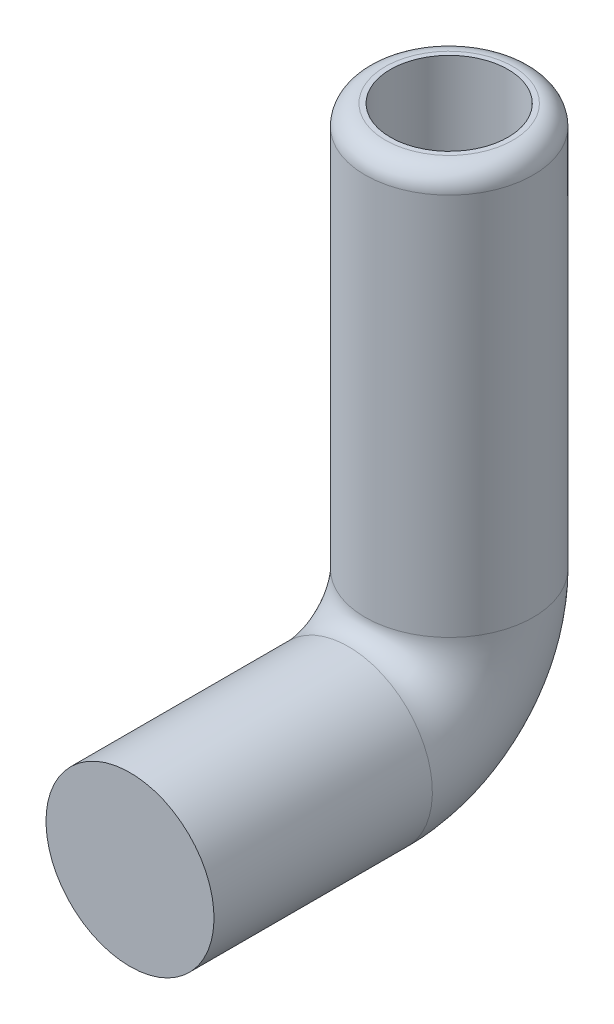
ISO-10303-21;
HEADER;
FILE_DESCRIPTION(('STEP AP214'),'2;1');
FILE_NAME('part.step','',(''),(''),'','','');
FILE_SCHEMA(('AUTOMOTIVE_DESIGN { 1 0 10303 214 1 1 1 1 }'));
ENDSEC;
DATA;
#1=APPLICATION_CONTEXT('core data for automotive mechanical design processes');
#2=APPLICATION_PROTOCOL_DEFINITION('international standard','automotive_design',2000,#1);
#3=PRODUCT_CONTEXT('',#1,'mechanical');
#4=PRODUCT('Part','Part','',(#3));
#5=PRODUCT_RELATED_PRODUCT_CATEGORY('part','',(#4));
#6=PRODUCT_DEFINITION_FORMATION('','',#4);
#7=PRODUCT_DEFINITION_CONTEXT('part definition',#1,'design');
#8=PRODUCT_DEFINITION('design','',#6,#7);
#9=PRODUCT_DEFINITION_SHAPE('','',#8);
#10=(LENGTH_UNIT() NAMED_UNIT(*) SI_UNIT(.MILLI.,.METRE.));
#11=(NAMED_UNIT(*) PLANE_ANGLE_UNIT() SI_UNIT($,.RADIAN.));
#12=(NAMED_UNIT(*) SI_UNIT($,.STERADIAN.) SOLID_ANGLE_UNIT());
#13=UNCERTAINTY_MEASURE_WITH_UNIT(LENGTH_MEASURE(1.E-05),#10,'distance_accuracy_value','');
#14=(GEOMETRIC_REPRESENTATION_CONTEXT(3) GLOBAL_UNCERTAINTY_ASSIGNED_CONTEXT((#13)) GLOBAL_UNIT_ASSIGNED_CONTEXT((#10,
#11,#12)) REPRESENTATION_CONTEXT('',''));
#15=CARTESIAN_POINT('',(0.,0.,0.));
#16=DIRECTION('',(0.,0.,1.));
#17=DIRECTION('',(1.,0.,0.));
#18=AXIS2_PLACEMENT_3D('',#15,#16,#17);
#19=CARTESIAN_POINT('',(0.,0.,65.));
#20=DIRECTION('',(0.,0.,1.));
#21=DIRECTION('',(0.,-1.,0.));
#22=AXIS2_PLACEMENT_3D('',#19,#20,#21);
#23=PLANE('',#22);
#24=CARTESIAN_POINT('',(0.,0.,65.));
#25=DIRECTION('',(0.,0.,1.));
#26=DIRECTION('',(0.,-1.,0.));
#27=AXIS2_PLACEMENT_3D('',#24,#25,#26);
#28=CIRCLE('',#27,25.);
#29=CARTESIAN_POINT('',(0.,-25.,65.));
#30=VERTEX_POINT('',#29);
#31=EDGE_CURVE('E81',#30,#30,#28,.T.);
#32=ORIENTED_EDGE('',*,*,#31,.T.);
#33=EDGE_LOOP('',(#32));
#34=FACE_BOUND('',#33,.T.);
#35=ADVANCED_FACE('F55',(#34),#23,.T.);
#36=CARTESIAN_POINT('',(0.,0.,65.));
#37=DIRECTION('',(0.,0.,-1.));
#38=DIRECTION('',(-1.,0.,0.));
#39=AXIS2_PLACEMENT_3D('',#36,#37,#38);
#40=CYLINDRICAL_SURFACE('',#39,25.);
#41=CARTESIAN_POINT('',(0.,0.,0.));
#42=DIRECTION('',(0.,0.,1.));
#43=DIRECTION('',(0.,-1.,0.));
#44=AXIS2_PLACEMENT_3D('',#41,#42,#43);
#45=CIRCLE('',#44,25.);
#46=CARTESIAN_POINT('',(0.,-25.,0.));
#47=VERTEX_POINT('',#46);
#48=EDGE_CURVE('E76',#47,#47,#45,.T.);
#49=ORIENTED_EDGE('',*,*,#48,.T.);
#50=EDGE_LOOP('',(#49));
#51=FACE_BOUND('',#50,.T.);
#52=ORIENTED_EDGE('',*,*,#31,.F.);
#53=EDGE_LOOP('',(#52));
#54=FACE_BOUND('',#53,.T.);
#55=ADVANCED_FACE('F108',(#51,#54),#40,.T.);
#56=CARTESIAN_POINT('',(0.,30.,0.));
#57=DIRECTION('',(1.,0.,0.));
#58=DIRECTION('',(0.,0.,-1.));
#59=AXIS2_PLACEMENT_3D('',#56,#57,#58);
#60=TOROIDAL_SURFACE('',#59,30.,25.);
#61=CARTESIAN_POINT('',(0.,30.,-30.));
#62=DIRECTION('',(0.,-1.,0.));
#63=DIRECTION('',(0.,0.,-1.));
#64=AXIS2_PLACEMENT_3D('',#61,#62,#63);
#65=CIRCLE('',#64,25.);
#66=CARTESIAN_POINT('',(0.,30.,-55.));
#67=VERTEX_POINT('',#66);
#68=EDGE_CURVE('E70',#67,#67,#65,.T.);
#69=CARTESIAN_POINT('',(0.,30.,0.));
#70=DIRECTION('',(1.,0.,0.));
#71=DIRECTION('',(0.,0.,-1.));
#72=AXIS2_PLACEMENT_3D('',#69,#70,#71);
#73=CIRCLE('',#72,55.);
#74=EDGE_CURVE('',#47,#67,#73,.T.);
#75=ORIENTED_EDGE('',*,*,#48,.F.);
#76=ORIENTED_EDGE('',*,*,#68,.T.);
#77=ORIENTED_EDGE('',*,*,#74,.T.);
#78=ORIENTED_EDGE('',*,*,#74,.F.);
#79=EDGE_LOOP('',(#75,#77,#76,#78));
#80=FACE_BOUND('',#79,.T.);
#81=ADVANCED_FACE('F104',(#80),#60,.T.);
#82=CARTESIAN_POINT('',(0.,30.,-30.));
#83=DIRECTION('',(0.,1.,0.));
#84=DIRECTION('',(0.,0.,1.));
#85=AXIS2_PLACEMENT_3D('',#82,#83,#84);
#86=CYLINDRICAL_SURFACE('',#85,25.);
#87=CARTESIAN_POINT('',(0.,144.,-30.));
#88=DIRECTION('',(0.,1.,0.));
#89=DIRECTION('',(0.,0.,1.));
#90=AXIS2_PLACEMENT_3D('',#87,#88,#89);
#91=CIRCLE('',#90,25.);
#92=CARTESIAN_POINT('',(0.,144.,-5.));
#93=VERTEX_POINT('',#92);
#94=EDGE_CURVE('E11',#93,#93,#91,.F.);
#95=ORIENTED_EDGE('',*,*,#94,.T.);
#96=EDGE_LOOP('',(#95));
#97=FACE_BOUND('',#96,.T.);
#98=ORIENTED_EDGE('',*,*,#68,.F.);
#99=EDGE_LOOP('',(#98));
#100=FACE_BOUND('',#99,.T.);
#101=ADVANCED_FACE('F97',(#97,#100),#86,.T.);
#102=CARTESIAN_POINT('',(0.,150.,-30.));
#103=DIRECTION('',(0.,-1.,0.));
#104=DIRECTION('',(0.,0.,-1.));
#105=AXIS2_PLACEMENT_3D('',#102,#103,#104);
#106=CYLINDRICAL_SURFACE('',#105,17.5);
#107=CARTESIAN_POINT('',(0.,150.,-30.));
#108=DIRECTION('',(0.,1.,0.));
#109=DIRECTION('',(0.,0.,1.));
#110=AXIS2_PLACEMENT_3D('',#107,#108,#109);
#111=CIRCLE('',#110,17.5);
#112=CARTESIAN_POINT('',(0.,150.,-12.5));
#113=VERTEX_POINT('',#112);
#114=EDGE_CURVE('E84',#113,#113,#111,.T.);
#115=ORIENTED_EDGE('',*,*,#114,.T.);
#116=EDGE_LOOP('',(#115));
#117=FACE_BOUND('',#116,.T.);
#118=CARTESIAN_POINT('',(0.,40.,-30.));
#119=DIRECTION('',(0.,1.,0.));
#120=DIRECTION('',(0.,0.,1.));
#121=AXIS2_PLACEMENT_3D('',#118,#119,#120);
#122=CIRCLE('',#121,17.5);
#123=CARTESIAN_POINT('',(0.,40.,-12.5));
#124=VERTEX_POINT('',#123);
#125=EDGE_CURVE('E88',#124,#124,#122,.T.);
#126=ORIENTED_EDGE('',*,*,#125,.F.);
#127=EDGE_LOOP('',(#126));
#128=FACE_BOUND('',#127,.T.);
#129=ADVANCED_FACE('F94',(#117,#128),#106,.F.);
#130=CARTESIAN_POINT('',(0.,150.,0.));
#131=DIRECTION('',(0.,1.,0.));
#132=DIRECTION('',(0.,0.,1.));
#133=AXIS2_PLACEMENT_3D('',#130,#131,#132);
#134=PLANE('',#133);
#135=CARTESIAN_POINT('',(0.,150.,-30.));
#136=DIRECTION('',(0.,1.,0.));
#137=DIRECTION('',(0.,0.,1.));
#138=AXIS2_PLACEMENT_3D('',#135,#136,#137);
#139=CIRCLE('',#138,19.);
#140=CARTESIAN_POINT('',(0.,150.,-11.));
#141=VERTEX_POINT('',#140);
#142=EDGE_CURVE('E63',#141,#141,#139,.T.);
#143=ORIENTED_EDGE('',*,*,#142,.T.);
#144=EDGE_LOOP('',(#143));
#145=FACE_BOUND('',#144,.T.);
#146=ORIENTED_EDGE('',*,*,#114,.F.);
#147=EDGE_LOOP('',(#146));
#148=FACE_BOUND('',#147,.T.);
#149=ADVANCED_FACE('F96',(#145,#148),#134,.T.);
#150=CARTESIAN_POINT('',(0.,144.,-30.));
#151=DIRECTION('',(0.,1.,0.));
#152=DIRECTION('',(0.,0.,1.));
#153=AXIS2_PLACEMENT_3D('',#150,#151,#152);
#154=TOROIDAL_SURFACE('',#153,19.,6.);
#155=ORIENTED_EDGE('',*,*,#94,.F.);
#156=EDGE_LOOP('',(#155));
#157=FACE_BOUND('',#156,.T.);
#158=ORIENTED_EDGE('',*,*,#142,.F.);
#159=EDGE_LOOP('',(#158));
#160=FACE_BOUND('',#159,.T.);
#161=ADVANCED_FACE('F57',(#157,#160),#154,.T.);
#162=CARTESIAN_POINT('',(0.,40.,-30.));
#163=DIRECTION('',(0.,1.,0.));
#164=DIRECTION('',(0.,0.,1.));
#165=AXIS2_PLACEMENT_3D('',#162,#163,#164);
#166=PLANE('',#165);
#167=ORIENTED_EDGE('',*,*,#125,.T.);
#168=EDGE_LOOP('',(#167));
#169=FACE_BOUND('',#168,.T.);
#170=ADVANCED_FACE('F92',(#169),#166,.T.);
#171=CLOSED_SHELL('',(#35,#55,#81,#101,#129,#149,#161,#170));
#172=MANIFOLD_SOLID_BREP('B2',#171);
#173=ADVANCED_BREP_SHAPE_REPRESENTATION('',(#18,#172),#14);
#174=SHAPE_DEFINITION_REPRESENTATION(#9,#173);
ENDSEC;
END-ISO-10303-21;
